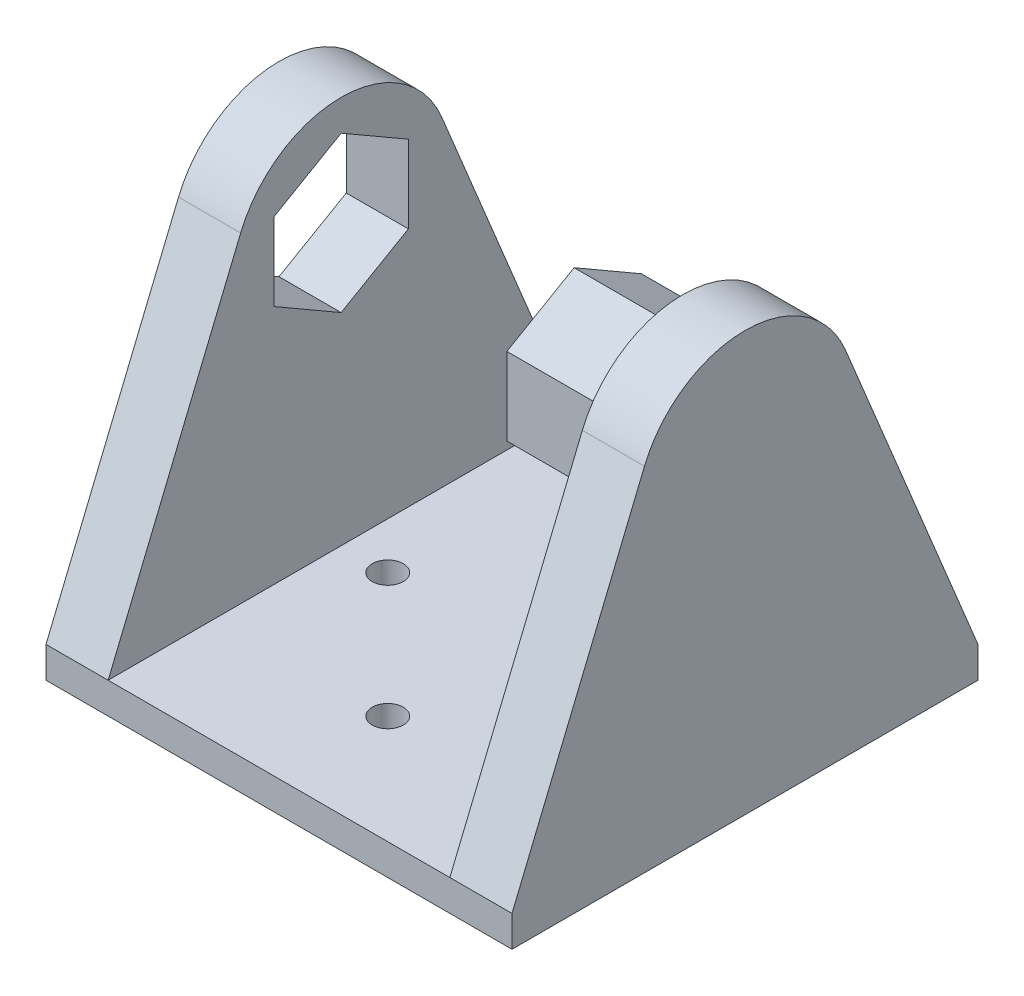
ISO-10303-21;
HEADER;
FILE_DESCRIPTION(('STEP AP214'),'2;1');
FILE_NAME('part.step','',(''),(''),'','','');
FILE_SCHEMA(('AUTOMOTIVE_DESIGN { 1 0 10303 214 1 1 1 1 }'));
ENDSEC;
DATA;
#1=APPLICATION_CONTEXT('core data for automotive mechanical design processes');
#2=APPLICATION_PROTOCOL_DEFINITION('international standard','automotive_design',2000,#1);
#3=PRODUCT_CONTEXT('',#1,'mechanical');
#4=PRODUCT('Part','Part','',(#3));
#5=PRODUCT_RELATED_PRODUCT_CATEGORY('part','',(#4));
#6=PRODUCT_DEFINITION_FORMATION('','',#4);
#7=PRODUCT_DEFINITION_CONTEXT('part definition',#1,'design');
#8=PRODUCT_DEFINITION('design','',#6,#7);
#9=PRODUCT_DEFINITION_SHAPE('','',#8);
#10=(LENGTH_UNIT() NAMED_UNIT(*) SI_UNIT(.MILLI.,.METRE.));
#11=(NAMED_UNIT(*) PLANE_ANGLE_UNIT() SI_UNIT($,.RADIAN.));
#12=(NAMED_UNIT(*) SI_UNIT($,.STERADIAN.) SOLID_ANGLE_UNIT());
#13=UNCERTAINTY_MEASURE_WITH_UNIT(LENGTH_MEASURE(1.E-05),#10,'distance_accuracy_value','');
#14=(GEOMETRIC_REPRESENTATION_CONTEXT(3) GLOBAL_UNCERTAINTY_ASSIGNED_CONTEXT((#13)) GLOBAL_UNIT_ASSIGNED_CONTEXT((#10,
#11,#12)) REPRESENTATION_CONTEXT('',''));
#15=CARTESIAN_POINT('',(0.,0.,0.));
#16=DIRECTION('',(0.,0.,1.));
#17=DIRECTION('',(1.,0.,0.));
#18=AXIS2_PLACEMENT_3D('',#15,#16,#17);
#19=CARTESIAN_POINT('',(11.,27.,-15.));
#20=DIRECTION('',(1.,0.,0.));
#21=DIRECTION('',(0.,0.,-1.));
#22=AXIS2_PLACEMENT_3D('',#19,#20,#21);
#23=PLANE('',#22);
#24=CARTESIAN_POINT('',(11.,20.,0.));
#25=DIRECTION('',(1.,0.,0.));
#26=DIRECTION('',(0.,0.,-1.));
#27=AXIS2_PLACEMENT_3D('',#24,#25,#26);
#28=CIRCLE('',#27,7.);
#29=CARTESIAN_POINT('',(11.,22.6700753668029,-6.47075710683012));
#30=VERTEX_POINT('',#29);
#31=CARTESIAN_POINT('',(11.,22.6700753668029,6.47075710683011));
#32=VERTEX_POINT('',#31);
#33=EDGE_CURVE('E346',#30,#32,#28,.T.);
#34=ORIENTED_EDGE('',*,*,#33,.F.);
#35=DIRECTION('',(0.,-0.924393872404303,-0.381439338114697));
#36=VECTOR('',#35,1.);
#37=CARTESIAN_POINT('',(11.,23.3626007834656,-6.18499532882054));
#38=LINE('',#37,#36);
#39=CARTESIAN_POINT('',(11.,2.,-15.));
#40=VERTEX_POINT('',#39);
#41=EDGE_CURVE('E318',#30,#40,#38,.T.);
#42=ORIENTED_EDGE('',*,*,#41,.T.);
#43=DIRECTION('',(0.,0.,1.));
#44=VECTOR('',#43,1.);
#45=CARTESIAN_POINT('',(11.,2.,-15.));
#46=LINE('',#45,#44);
#47=CARTESIAN_POINT('',(11.,2.,15.));
#48=VERTEX_POINT('',#47);
#49=EDGE_CURVE('E361',#40,#48,#46,.T.);
#50=ORIENTED_EDGE('',*,*,#49,.T.);
#51=DIRECTION('',(0.,-0.924393872404303,0.381439338114697));
#52=VECTOR('',#51,1.);
#53=CARTESIAN_POINT('',(11.,33.9406063888809,1.82011626897919));
#54=LINE('',#53,#52);
#55=EDGE_CURVE('E437',#32,#48,#54,.T.);
#56=ORIENTED_EDGE('',*,*,#55,.F.);
#57=EDGE_LOOP('',(#34,#42,#50,#56));
#58=FACE_BOUND('',#57,.T.);
#59=DIRECTION('',(0.,0.5,-0.866025403784438));
#60=VECTOR('',#59,1.);
#61=CARTESIAN_POINT('',(11.,22.5,4.3301270189222));
#62=LINE('',#61,#60);
#63=CARTESIAN_POINT('',(11.,22.5,4.3301270189222));
#64=VERTEX_POINT('',#63);
#65=CARTESIAN_POINT('',(11.,25.,0.));
#66=VERTEX_POINT('',#65);
#67=EDGE_CURVE('E228',#64,#66,#62,.T.);
#68=ORIENTED_EDGE('',*,*,#67,.F.);
#69=DIRECTION('',(0.,1.,0.));
#70=VECTOR('',#69,1.);
#71=CARTESIAN_POINT('',(11.,17.5,4.3301270189222));
#72=LINE('',#71,#70);
#73=CARTESIAN_POINT('',(11.,17.5,4.3301270189222));
#74=VERTEX_POINT('',#73);
#75=EDGE_CURVE('E244',#74,#64,#72,.T.);
#76=ORIENTED_EDGE('',*,*,#75,.F.);
#77=DIRECTION('',(0.,0.5,0.866025403784439));
#78=VECTOR('',#77,1.);
#79=CARTESIAN_POINT('',(11.,15.,0.));
#80=LINE('',#79,#78);
#81=CARTESIAN_POINT('',(11.,15.,0.));
#82=VERTEX_POINT('',#81);
#83=EDGE_CURVE('E275',#82,#74,#80,.T.);
#84=ORIENTED_EDGE('',*,*,#83,.F.);
#85=DIRECTION('',(0.,-0.5,0.866025403784439));
#86=VECTOR('',#85,1.);
#87=CARTESIAN_POINT('',(11.,17.5,-4.33012701892219));
#88=LINE('',#87,#86);
#89=CARTESIAN_POINT('',(11.,17.5,-4.3301270189222));
#90=VERTEX_POINT('',#89);
#91=EDGE_CURVE('E271',#90,#82,#88,.T.);
#92=ORIENTED_EDGE('',*,*,#91,.F.);
#93=DIRECTION('',(0.,-1.,0.));
#94=VECTOR('',#93,1.);
#95=CARTESIAN_POINT('',(11.,22.5,-4.33012701892219));
#96=LINE('',#95,#94);
#97=CARTESIAN_POINT('',(11.,22.5,-4.33012701892219));
#98=VERTEX_POINT('',#97);
#99=EDGE_CURVE('E267',#98,#90,#96,.T.);
#100=ORIENTED_EDGE('',*,*,#99,.F.);
#101=DIRECTION('',(0.,-0.5,-0.866025403784438));
#102=VECTOR('',#101,1.);
#103=CARTESIAN_POINT('',(11.,25.,0.));
#104=LINE('',#103,#102);
#105=EDGE_CURVE('E263',#66,#98,#104,.T.);
#106=ORIENTED_EDGE('',*,*,#105,.F.);
#107=EDGE_LOOP('',(#68,#76,#84,#92,#100,#106));
#108=FACE_BOUND('',#107,.T.);
#109=ADVANCED_FACE('F38',(#58,#108),#23,.F.);
#110=CARTESIAN_POINT('',(15.,2.,15.));
#111=DIRECTION('',(-1.,0.,0.));
#112=DIRECTION('',(0.,0.,1.));
#113=AXIS2_PLACEMENT_3D('',#110,#111,#112);
#114=PLANE('',#113);
#115=DIRECTION('',(0.,0.924393872404303,0.381439338114697));
#116=VECTOR('',#115,1.);
#117=CARTESIAN_POINT('',(15.,12.5780056054154,-10.6351209401587));
#118=LINE('',#117,#116);
#119=CARTESIAN_POINT('',(15.,2.,-15.));
#120=VERTEX_POINT('',#119);
#121=CARTESIAN_POINT('',(15.,22.6700753668029,-6.47075710683012));
#122=VERTEX_POINT('',#121);
#123=EDGE_CURVE('E326',#120,#122,#118,.T.);
#124=ORIENTED_EDGE('',*,*,#123,.T.);
#125=CARTESIAN_POINT('',(15.,20.,0.));
#126=DIRECTION('',(-1.,0.,0.));
#127=DIRECTION('',(0.,0.,1.));
#128=AXIS2_PLACEMENT_3D('',#125,#126,#127);
#129=CIRCLE('',#128,7.);
#130=CARTESIAN_POINT('',(15.,22.6700753668029,6.47075710683011));
#131=VERTEX_POINT('',#130);
#132=EDGE_CURVE('E352',#131,#122,#129,.T.);
#133=ORIENTED_EDGE('',*,*,#132,.F.);
#134=DIRECTION('',(0.,0.924393872404303,-0.381439338114697));
#135=VECTOR('',#134,1.);
#136=CARTESIAN_POINT('',(15.,2.,15.));
#137=LINE('',#136,#135);
#138=CARTESIAN_POINT('',(15.,2.,15.));
#139=VERTEX_POINT('',#138);
#140=EDGE_CURVE('E358',#139,#131,#137,.T.);
#141=ORIENTED_EDGE('',*,*,#140,.F.);
#142=DIRECTION('',(0.,-1.,0.));
#143=VECTOR('',#142,1.);
#144=CARTESIAN_POINT('',(15.,2.,15.));
#145=LINE('',#144,#143);
#146=CARTESIAN_POINT('',(15.,0.,15.));
#147=VERTEX_POINT('',#146);
#148=EDGE_CURVE('E411',#139,#147,#145,.T.);
#149=ORIENTED_EDGE('',*,*,#148,.T.);
#150=DIRECTION('',(0.,0.,-1.));
#151=VECTOR('',#150,1.);
#152=CARTESIAN_POINT('',(15.,0.,15.));
#153=LINE('',#152,#151);
#154=CARTESIAN_POINT('',(15.,0.,-15.));
#155=VERTEX_POINT('',#154);
#156=EDGE_CURVE('E374',#147,#155,#153,.T.);
#157=ORIENTED_EDGE('',*,*,#156,.T.);
#158=DIRECTION('',(0.,-1.,0.));
#159=VECTOR('',#158,1.);
#160=CARTESIAN_POINT('',(15.,2.,-15.));
#161=LINE('',#160,#159);
#162=EDGE_CURVE('E434',#120,#155,#161,.T.);
#163=ORIENTED_EDGE('',*,*,#162,.F.);
#164=EDGE_LOOP('',(#124,#133,#141,#149,#157,#163));
#165=FACE_BOUND('',#164,.T.);
#166=ADVANCED_FACE('F40',(#165),#114,.F.);
#167=CARTESIAN_POINT('',(-15.,2.,15.));
#168=DIRECTION('',(1.,0.,0.));
#169=DIRECTION('',(0.,0.,-1.));
#170=AXIS2_PLACEMENT_3D('',#167,#168,#169);
#171=PLANE('',#170);
#172=DIRECTION('',(0.,-0.5,-0.866025403784439));
#173=VECTOR('',#172,1.);
#174=CARTESIAN_POINT('',(-15.,25.,0.));
#175=LINE('',#174,#173);
#176=CARTESIAN_POINT('',(-15.,25.,0.));
#177=VERTEX_POINT('',#176);
#178=CARTESIAN_POINT('',(-15.,22.5,-4.33012701892219));
#179=VERTEX_POINT('',#178);
#180=EDGE_CURVE('E201',#177,#179,#175,.T.);
#181=ORIENTED_EDGE('',*,*,#180,.F.);
#182=DIRECTION('',(0.,0.5,-0.866025403784439));
#183=VECTOR('',#182,1.);
#184=CARTESIAN_POINT('',(-15.,22.5,4.3301270189222));
#185=LINE('',#184,#183);
#186=CARTESIAN_POINT('',(-15.,22.5,4.3301270189222));
#187=VERTEX_POINT('',#186);
#188=EDGE_CURVE('E54',#187,#177,#185,.T.);
#189=ORIENTED_EDGE('',*,*,#188,.F.);
#190=DIRECTION('',(0.,1.,0.));
#191=VECTOR('',#190,1.);
#192=CARTESIAN_POINT('',(-15.,17.5,4.3301270189222));
#193=LINE('',#192,#191);
#194=CARTESIAN_POINT('',(-15.,17.5,4.3301270189222));
#195=VERTEX_POINT('',#194);
#196=EDGE_CURVE('E221',#195,#187,#193,.T.);
#197=ORIENTED_EDGE('',*,*,#196,.F.);
#198=DIRECTION('',(0.,0.5,0.866025403784438));
#199=VECTOR('',#198,1.);
#200=CARTESIAN_POINT('',(-15.,15.,0.));
#201=LINE('',#200,#199);
#202=CARTESIAN_POINT('',(-15.,15.,0.));
#203=VERTEX_POINT('',#202);
#204=EDGE_CURVE('E214',#203,#195,#201,.T.);
#205=ORIENTED_EDGE('',*,*,#204,.F.);
#206=DIRECTION('',(0.,-0.5,0.866025403784438));
#207=VECTOR('',#206,1.);
#208=CARTESIAN_POINT('',(-15.,17.5,-4.33012701892219));
#209=LINE('',#208,#207);
#210=CARTESIAN_POINT('',(-15.,17.5,-4.33012701892219));
#211=VERTEX_POINT('',#210);
#212=EDGE_CURVE('E210',#211,#203,#209,.T.);
#213=ORIENTED_EDGE('',*,*,#212,.F.);
#214=DIRECTION('',(0.,-1.,0.));
#215=VECTOR('',#214,1.);
#216=CARTESIAN_POINT('',(-15.,22.5,-4.33012701892219));
#217=LINE('',#216,#215);
#218=EDGE_CURVE('E191',#179,#211,#217,.T.);
#219=ORIENTED_EDGE('',*,*,#218,.F.);
#220=EDGE_LOOP('',(#181,#189,#197,#205,#213,#219));
#221=FACE_BOUND('',#220,.T.);
#222=CARTESIAN_POINT('',(-15.,20.,0.));
#223=DIRECTION('',(-1.,0.,0.));
#224=DIRECTION('',(0.,0.,1.));
#225=AXIS2_PLACEMENT_3D('',#222,#223,#224);
#226=CIRCLE('',#225,7.);
#227=CARTESIAN_POINT('',(-15.,22.6700753668029,6.47075710683011));
#228=VERTEX_POINT('',#227);
#229=CARTESIAN_POINT('',(-15.,22.6700753668029,-6.47075710683012));
#230=VERTEX_POINT('',#229);
#231=EDGE_CURVE('E330',#228,#230,#226,.T.);
#232=ORIENTED_EDGE('',*,*,#231,.T.);
#233=DIRECTION('',(0.,0.924393872404303,0.381439338114697));
#234=VECTOR('',#233,1.);
#235=CARTESIAN_POINT('',(-15.,5.57999474003043,-13.5227608437737));
#236=LINE('',#235,#234);
#237=CARTESIAN_POINT('',(-15.,2.,-15.));
#238=VERTEX_POINT('',#237);
#239=EDGE_CURVE('E305',#238,#230,#236,.T.);
#240=ORIENTED_EDGE('',*,*,#239,.F.);
#241=DIRECTION('',(0.,-1.,0.));
#242=VECTOR('',#241,1.);
#243=CARTESIAN_POINT('',(-15.,2.,-15.));
#244=LINE('',#243,#242);
#245=CARTESIAN_POINT('',(-15.,0.,-15.));
#246=VERTEX_POINT('',#245);
#247=EDGE_CURVE('E431',#238,#246,#244,.T.);
#248=ORIENTED_EDGE('',*,*,#247,.T.);
#249=DIRECTION('',(0.,0.,1.));
#250=VECTOR('',#249,1.);
#251=CARTESIAN_POINT('',(-15.,0.,15.));
#252=LINE('',#251,#250);
#253=CARTESIAN_POINT('',(-15.,0.,15.));
#254=VERTEX_POINT('',#253);
#255=EDGE_CURVE('E419',#246,#254,#252,.T.);
#256=ORIENTED_EDGE('',*,*,#255,.T.);
#257=DIRECTION('',(0.,-1.,0.));
#258=VECTOR('',#257,1.);
#259=CARTESIAN_POINT('',(-15.,2.,15.));
#260=LINE('',#259,#258);
#261=CARTESIAN_POINT('',(-15.,2.,15.));
#262=VERTEX_POINT('',#261);
#263=EDGE_CURVE('E428',#262,#254,#260,.T.);
#264=ORIENTED_EDGE('',*,*,#263,.F.);
#265=DIRECTION('',(0.,0.924393872404303,-0.381439338114697));
#266=VECTOR('',#265,1.);
#267=CARTESIAN_POINT('',(-15.,5.57999474003043,13.5227608437737));
#268=LINE('',#267,#266);
#269=EDGE_CURVE('E333',#262,#228,#268,.T.);
#270=ORIENTED_EDGE('',*,*,#269,.T.);
#271=EDGE_LOOP('',(#232,#240,#248,#256,#264,#270));
#272=FACE_BOUND('',#271,.T.);
#273=ADVANCED_FACE('F206',(#221,#272),#171,.F.);
#274=CARTESIAN_POINT('',(-11.,27.,-15.));
#275=DIRECTION('',(-1.,0.,0.));
#276=DIRECTION('',(0.,0.,1.));
#277=AXIS2_PLACEMENT_3D('',#274,#275,#276);
#278=PLANE('',#277);
#279=DIRECTION('',(0.,1.,0.));
#280=VECTOR('',#279,1.);
#281=CARTESIAN_POINT('',(-11.,27.,4.3301270189222));
#282=LINE('',#281,#280);
#283=CARTESIAN_POINT('',(-11.,17.5,4.3301270189222));
#284=VERTEX_POINT('',#283);
#285=CARTESIAN_POINT('',(-11.,22.5,4.3301270189222));
#286=VERTEX_POINT('',#285);
#287=EDGE_CURVE('E47',#284,#286,#282,.T.);
#288=ORIENTED_EDGE('',*,*,#287,.T.);
#289=DIRECTION('',(0.,0.5,-0.866025403784439));
#290=VECTOR('',#289,1.);
#291=CARTESIAN_POINT('',(-11.,31.9951905283833,-12.1160254037844));
#292=LINE('',#291,#290);
#293=CARTESIAN_POINT('',(-11.,25.,0.));
#294=VERTEX_POINT('',#293);
#295=EDGE_CURVE('E11',#286,#294,#292,.T.);
#296=ORIENTED_EDGE('',*,*,#295,.T.);
#297=DIRECTION('',(0.,-0.5,-0.866025403784439));
#298=VECTOR('',#297,1.);
#299=CARTESIAN_POINT('',(-11.,19.0048094716167,-10.3839745962156));
#300=LINE('',#299,#298);
#301=CARTESIAN_POINT('',(-11.,22.5,-4.33012701892219));
#302=VERTEX_POINT('',#301);
#303=EDGE_CURVE('E440',#294,#302,#300,.T.);
#304=ORIENTED_EDGE('',*,*,#303,.T.);
#305=DIRECTION('',(0.,-1.,0.));
#306=VECTOR('',#305,1.);
#307=CARTESIAN_POINT('',(-11.,27.,-4.33012701892219));
#308=LINE('',#307,#306);
#309=CARTESIAN_POINT('',(-11.,17.5,-4.33012701892219));
#310=VERTEX_POINT('',#309);
#311=EDGE_CURVE('E194',#302,#310,#308,.T.);
#312=ORIENTED_EDGE('',*,*,#311,.T.);
#313=DIRECTION('',(0.,-0.5,0.866025403784438));
#314=VECTOR('',#313,1.);
#315=CARTESIAN_POINT('',(-11.,24.4951905283833,-16.4461524227066));
#316=LINE('',#315,#314);
#317=CARTESIAN_POINT('',(-11.,15.,0.));
#318=VERTEX_POINT('',#317);
#319=EDGE_CURVE('E445',#310,#318,#316,.T.);
#320=ORIENTED_EDGE('',*,*,#319,.T.);
#321=DIRECTION('',(0.,0.5,0.866025403784439));
#322=VECTOR('',#321,1.);
#323=CARTESIAN_POINT('',(-11.,11.5048094716167,-6.05384757729337));
#324=LINE('',#323,#322);
#325=EDGE_CURVE('E449',#318,#284,#324,.T.);
#326=ORIENTED_EDGE('',*,*,#325,.T.);
#327=EDGE_LOOP('',(#288,#296,#304,#312,#320,#326));
#328=FACE_BOUND('',#327,.T.);
#329=DIRECTION('',(0.,0.924393872404303,0.381439338114697));
#330=VECTOR('',#329,1.);
#331=CARTESIAN_POINT('',(-11.,23.3626007834656,-6.18499532882054));
#332=LINE('',#331,#330);
#333=CARTESIAN_POINT('',(-11.,2.,-15.));
#334=VERTEX_POINT('',#333);
#335=CARTESIAN_POINT('',(-11.,22.6700753668029,-6.47075710683012));
#336=VERTEX_POINT('',#335);
#337=EDGE_CURVE('E322',#334,#336,#332,.T.);
#338=ORIENTED_EDGE('',*,*,#337,.T.);
#339=CARTESIAN_POINT('',(-11.,20.,0.));
#340=DIRECTION('',(-1.,0.,0.));
#341=DIRECTION('',(0.,0.,1.));
#342=AXIS2_PLACEMENT_3D('',#339,#340,#341);
#343=CIRCLE('',#342,7.);
#344=CARTESIAN_POINT('',(-11.,22.6700753668029,6.47075710683011));
#345=VERTEX_POINT('',#344);
#346=EDGE_CURVE('E349',#345,#336,#343,.T.);
#347=ORIENTED_EDGE('',*,*,#346,.F.);
#348=DIRECTION('',(0.,0.924393872404303,-0.381439338114697));
#349=VECTOR('',#348,1.);
#350=CARTESIAN_POINT('',(-11.,33.9406063888809,1.82011626897919));
#351=LINE('',#350,#349);
#352=CARTESIAN_POINT('',(-11.,2.,15.));
#353=VERTEX_POINT('',#352);
#354=EDGE_CURVE('E355',#353,#345,#351,.T.);
#355=ORIENTED_EDGE('',*,*,#354,.F.);
#356=DIRECTION('',(0.,0.,-1.));
#357=VECTOR('',#356,1.);
#358=CARTESIAN_POINT('',(-11.,2.,-15.));
#359=LINE('',#358,#357);
#360=EDGE_CURVE('E365',#353,#334,#359,.T.);
#361=ORIENTED_EDGE('',*,*,#360,.T.);
#362=EDGE_LOOP('',(#338,#347,#355,#361));
#363=FACE_BOUND('',#362,.T.);
#364=ADVANCED_FACE('F455',(#328,#363),#278,.F.);
#365=CARTESIAN_POINT('',(-15.,2.,15.));
#366=DIRECTION('',(0.,0.,-1.));
#367=DIRECTION('',(-1.,0.,0.));
#368=AXIS2_PLACEMENT_3D('',#365,#366,#367);
#369=PLANE('',#368);
#370=DIRECTION('',(-1.,0.,0.));
#371=VECTOR('',#370,1.);
#372=CARTESIAN_POINT('',(23.,2.,15.));
#373=LINE('',#372,#371);
#374=EDGE_CURVE('E338',#353,#262,#373,.T.);
#375=ORIENTED_EDGE('',*,*,#374,.T.);
#376=ORIENTED_EDGE('',*,*,#263,.T.);
#377=DIRECTION('',(1.,0.,0.));
#378=VECTOR('',#377,1.);
#379=CARTESIAN_POINT('',(-15.,0.,15.));
#380=LINE('',#379,#378);
#381=EDGE_CURVE('E407',#254,#147,#380,.T.);
#382=ORIENTED_EDGE('',*,*,#381,.T.);
#383=ORIENTED_EDGE('',*,*,#148,.F.);
#384=EDGE_CURVE('E342',#139,#48,#373,.T.);
#385=ORIENTED_EDGE('',*,*,#384,.T.);
#386=DIRECTION('',(1.,0.,0.));
#387=VECTOR('',#386,1.);
#388=CARTESIAN_POINT('',(-15.,2.,15.));
#389=LINE('',#388,#387);
#390=EDGE_CURVE('E406',#353,#48,#389,.T.);
#391=ORIENTED_EDGE('',*,*,#390,.F.);
#392=EDGE_LOOP('',(#375,#376,#382,#383,#385,#391));
#393=FACE_BOUND('',#392,.T.);
#394=ADVANCED_FACE('F495',(#393),#369,.F.);
#395=CARTESIAN_POINT('',(0.,2.,0.));
#396=DIRECTION('',(0.,-1.,0.));
#397=DIRECTION('',(0.,0.,-1.));
#398=AXIS2_PLACEMENT_3D('',#395,#396,#397);
#399=PLANE('',#398);
#400=CARTESIAN_POINT('',(0.,2.,-8.));
#401=DIRECTION('',(0.,1.,0.));
#402=DIRECTION('',(0.,0.,1.));
#403=AXIS2_PLACEMENT_3D('',#400,#401,#402);
#404=CIRCLE('',#403,1.);
#405=CARTESIAN_POINT('',(0.,2.,-7.));
#406=VERTEX_POINT('',#405);
#407=EDGE_CURVE('E375',#406,#406,#404,.T.);
#408=ORIENTED_EDGE('',*,*,#407,.F.);
#409=EDGE_LOOP('',(#408));
#410=FACE_BOUND('',#409,.T.);
#411=CARTESIAN_POINT('',(8.,2.,0.));
#412=DIRECTION('',(0.,1.,0.));
#413=DIRECTION('',(0.,0.,1.));
#414=AXIS2_PLACEMENT_3D('',#411,#412,#413);
#415=CIRCLE('',#414,1.);
#416=CARTESIAN_POINT('',(8.,2.,0.999999999999999));
#417=VERTEX_POINT('',#416);
#418=EDGE_CURVE('E383',#417,#417,#415,.T.);
#419=ORIENTED_EDGE('',*,*,#418,.F.);
#420=EDGE_LOOP('',(#419));
#421=FACE_BOUND('',#420,.T.);
#422=CARTESIAN_POINT('',(-8.,2.,0.));
#423=DIRECTION('',(0.,1.,0.));
#424=DIRECTION('',(0.,0.,1.));
#425=AXIS2_PLACEMENT_3D('',#422,#423,#424);
#426=CIRCLE('',#425,1.);
#427=CARTESIAN_POINT('',(-8.,2.,1.));
#428=VERTEX_POINT('',#427);
#429=EDGE_CURVE('E391',#428,#428,#426,.T.);
#430=ORIENTED_EDGE('',*,*,#429,.F.);
#431=EDGE_LOOP('',(#430));
#432=FACE_BOUND('',#431,.T.);
#433=CARTESIAN_POINT('',(0.,2.,8.));
#434=DIRECTION('',(0.,1.,0.));
#435=DIRECTION('',(0.,0.,1.));
#436=AXIS2_PLACEMENT_3D('',#433,#434,#435);
#437=CIRCLE('',#436,1.);
#438=CARTESIAN_POINT('',(0.,2.,9.));
#439=VERTEX_POINT('',#438);
#440=EDGE_CURVE('E369',#439,#439,#437,.T.);
#441=ORIENTED_EDGE('',*,*,#440,.F.);
#442=EDGE_LOOP('',(#441));
#443=FACE_BOUND('',#442,.T.);
#444=ORIENTED_EDGE('',*,*,#49,.F.);
#445=DIRECTION('',(-1.,0.,0.));
#446=VECTOR('',#445,1.);
#447=CARTESIAN_POINT('',(-15.,2.,-15.));
#448=LINE('',#447,#446);
#449=EDGE_CURVE('E402',#40,#334,#448,.T.);
#450=ORIENTED_EDGE('',*,*,#449,.T.);
#451=ORIENTED_EDGE('',*,*,#360,.F.);
#452=ORIENTED_EDGE('',*,*,#390,.T.);
#453=EDGE_LOOP('',(#444,#450,#451,#452));
#454=FACE_BOUND('',#453,.T.);
#455=ADVANCED_FACE('F513',(#410,#421,#432,#443,#454),#399,.F.);
#456=CARTESIAN_POINT('',(-15.,2.,-15.));
#457=DIRECTION('',(0.,0.,1.));
#458=DIRECTION('',(1.,0.,0.));
#459=AXIS2_PLACEMENT_3D('',#456,#457,#458);
#460=PLANE('',#459);
#461=ORIENTED_EDGE('',*,*,#247,.F.);
#462=DIRECTION('',(-1.,0.,0.));
#463=VECTOR('',#462,1.);
#464=CARTESIAN_POINT('',(23.,2.,-15.));
#465=LINE('',#464,#463);
#466=EDGE_CURVE('E309',#334,#238,#465,.T.);
#467=ORIENTED_EDGE('',*,*,#466,.F.);
#468=ORIENTED_EDGE('',*,*,#449,.F.);
#469=EDGE_CURVE('E315',#120,#40,#465,.T.);
#470=ORIENTED_EDGE('',*,*,#469,.F.);
#471=ORIENTED_EDGE('',*,*,#162,.T.);
#472=DIRECTION('',(-1.,0.,0.));
#473=VECTOR('',#472,1.);
#474=CARTESIAN_POINT('',(-15.,0.,-15.));
#475=LINE('',#474,#473);
#476=EDGE_CURVE('E415',#155,#246,#475,.T.);
#477=ORIENTED_EDGE('',*,*,#476,.T.);
#478=EDGE_LOOP('',(#461,#467,#468,#470,#471,#477));
#479=FACE_BOUND('',#478,.T.);
#480=ADVANCED_FACE('F516',(#479),#460,.F.);
#481=CARTESIAN_POINT('',(0.,0.,0.));
#482=DIRECTION('',(0.,-1.,0.));
#483=DIRECTION('',(0.,0.,-1.));
#484=AXIS2_PLACEMENT_3D('',#481,#482,#483);
#485=PLANE('',#484);
#486=CARTESIAN_POINT('',(0.,0.,-8.));
#487=DIRECTION('',(0.,1.,0.));
#488=DIRECTION('',(0.,0.,1.));
#489=AXIS2_PLACEMENT_3D('',#486,#487,#488);
#490=CIRCLE('',#489,1.);
#491=CARTESIAN_POINT('',(0.,0.,-7.));
#492=VERTEX_POINT('',#491);
#493=EDGE_CURVE('E370',#492,#492,#490,.T.);
#494=ORIENTED_EDGE('',*,*,#493,.T.);
#495=EDGE_LOOP('',(#494));
#496=FACE_BOUND('',#495,.T.);
#497=CARTESIAN_POINT('',(8.,0.,0.));
#498=DIRECTION('',(0.,1.,0.));
#499=DIRECTION('',(0.,0.,1.));
#500=AXIS2_PLACEMENT_3D('',#497,#498,#499);
#501=CIRCLE('',#500,1.);
#502=CARTESIAN_POINT('',(8.,0.,0.999999999999999));
#503=VERTEX_POINT('',#502);
#504=EDGE_CURVE('E379',#503,#503,#501,.T.);
#505=ORIENTED_EDGE('',*,*,#504,.T.);
#506=EDGE_LOOP('',(#505));
#507=FACE_BOUND('',#506,.T.);
#508=CARTESIAN_POINT('',(-8.,0.,0.));
#509=DIRECTION('',(0.,1.,0.));
#510=DIRECTION('',(0.,0.,1.));
#511=AXIS2_PLACEMENT_3D('',#508,#509,#510);
#512=CIRCLE('',#511,1.);
#513=CARTESIAN_POINT('',(-8.,0.,1.));
#514=VERTEX_POINT('',#513);
#515=EDGE_CURVE('E387',#514,#514,#512,.T.);
#516=ORIENTED_EDGE('',*,*,#515,.T.);
#517=EDGE_LOOP('',(#516));
#518=FACE_BOUND('',#517,.T.);
#519=CARTESIAN_POINT('',(0.,0.,8.));
#520=DIRECTION('',(0.,1.,0.));
#521=DIRECTION('',(0.,0.,1.));
#522=AXIS2_PLACEMENT_3D('',#519,#520,#521);
#523=CIRCLE('',#522,1.);
#524=CARTESIAN_POINT('',(0.,0.,9.));
#525=VERTEX_POINT('',#524);
#526=EDGE_CURVE('E395',#525,#525,#523,.T.);
#527=ORIENTED_EDGE('',*,*,#526,.T.);
#528=EDGE_LOOP('',(#527));
#529=FACE_BOUND('',#528,.T.);
#530=ORIENTED_EDGE('',*,*,#156,.F.);
#531=ORIENTED_EDGE('',*,*,#381,.F.);
#532=ORIENTED_EDGE('',*,*,#255,.F.);
#533=ORIENTED_EDGE('',*,*,#476,.F.);
#534=EDGE_LOOP('',(#530,#531,#532,#533));
#535=FACE_BOUND('',#534,.T.);
#536=ADVANCED_FACE('F511',(#496,#507,#518,#529,#535),#485,.T.);
#537=CARTESIAN_POINT('',(0.,0.,8.));
#538=DIRECTION('',(0.,1.,0.));
#539=DIRECTION('',(0.,0.,1.));
#540=AXIS2_PLACEMENT_3D('',#537,#538,#539);
#541=CYLINDRICAL_SURFACE('',#540,1.);
#542=ORIENTED_EDGE('',*,*,#526,.F.);
#543=EDGE_LOOP('',(#542));
#544=FACE_BOUND('',#543,.T.);
#545=ORIENTED_EDGE('',*,*,#440,.T.);
#546=EDGE_LOOP('',(#545));
#547=FACE_BOUND('',#546,.T.);
#548=ADVANCED_FACE('F507',(#544,#547),#541,.F.);
#549=CARTESIAN_POINT('',(-8.,0.,0.));
#550=DIRECTION('',(0.,1.,0.));
#551=DIRECTION('',(0.,0.,1.));
#552=AXIS2_PLACEMENT_3D('',#549,#550,#551);
#553=CYLINDRICAL_SURFACE('',#552,1.);
#554=ORIENTED_EDGE('',*,*,#515,.F.);
#555=EDGE_LOOP('',(#554));
#556=FACE_BOUND('',#555,.T.);
#557=ORIENTED_EDGE('',*,*,#429,.T.);
#558=EDGE_LOOP('',(#557));
#559=FACE_BOUND('',#558,.T.);
#560=ADVANCED_FACE('F503',(#556,#559),#553,.F.);
#561=CARTESIAN_POINT('',(8.,0.,0.));
#562=DIRECTION('',(0.,1.,0.));
#563=DIRECTION('',(0.,0.,1.));
#564=AXIS2_PLACEMENT_3D('',#561,#562,#563);
#565=CYLINDRICAL_SURFACE('',#564,1.);
#566=ORIENTED_EDGE('',*,*,#504,.F.);
#567=EDGE_LOOP('',(#566));
#568=FACE_BOUND('',#567,.T.);
#569=ORIENTED_EDGE('',*,*,#418,.T.);
#570=EDGE_LOOP('',(#569));
#571=FACE_BOUND('',#570,.T.);
#572=ADVANCED_FACE('F499',(#568,#571),#565,.F.);
#573=CARTESIAN_POINT('',(0.,0.,-8.));
#574=DIRECTION('',(0.,1.,0.));
#575=DIRECTION('',(0.,0.,1.));
#576=AXIS2_PLACEMENT_3D('',#573,#574,#575);
#577=CYLINDRICAL_SURFACE('',#576,1.);
#578=ORIENTED_EDGE('',*,*,#493,.F.);
#579=EDGE_LOOP('',(#578));
#580=FACE_BOUND('',#579,.T.);
#581=ORIENTED_EDGE('',*,*,#407,.T.);
#582=EDGE_LOOP('',(#581));
#583=FACE_BOUND('',#582,.T.);
#584=ADVANCED_FACE('F496',(#580,#583),#577,.F.);
#585=CARTESIAN_POINT('',(23.,20.,0.));
#586=DIRECTION('',(-1.,0.,0.));
#587=DIRECTION('',(0.,0.,1.));
#588=AXIS2_PLACEMENT_3D('',#585,#586,#587);
#589=CYLINDRICAL_SURFACE('',#588,7.);
#590=ORIENTED_EDGE('',*,*,#132,.T.);
#591=DIRECTION('',(-1.,0.,0.));
#592=VECTOR('',#591,1.);
#593=CARTESIAN_POINT('',(23.,22.6700753668029,-6.47075710683012));
#594=LINE('',#593,#592);
#595=EDGE_CURVE('E314',#122,#30,#594,.T.);
#596=ORIENTED_EDGE('',*,*,#595,.T.);
#597=ORIENTED_EDGE('',*,*,#33,.T.);
#598=DIRECTION('',(-1.,0.,0.));
#599=VECTOR('',#598,1.);
#600=CARTESIAN_POINT('',(23.,22.6700753668029,6.47075710683011));
#601=LINE('',#600,#599);
#602=EDGE_CURVE('E343',#131,#32,#601,.T.);
#603=ORIENTED_EDGE('',*,*,#602,.F.);
#604=EDGE_LOOP('',(#590,#596,#597,#603));
#605=FACE_BOUND('',#604,.T.);
#606=ADVANCED_FACE('F491',(#605),#589,.T.);
#607=CARTESIAN_POINT('',(23.,5.57999474003043,13.5227608437737));
#608=DIRECTION('',(0.,0.381439338114697,0.924393872404303));
#609=DIRECTION('',(0.,-0.924393872404303,0.381439338114697));
#610=AXIS2_PLACEMENT_3D('',#607,#608,#609);
#611=PLANE('',#610);
#612=ORIENTED_EDGE('',*,*,#140,.T.);
#613=ORIENTED_EDGE('',*,*,#602,.T.);
#614=ORIENTED_EDGE('',*,*,#55,.T.);
#615=ORIENTED_EDGE('',*,*,#384,.F.);
#616=EDGE_LOOP('',(#612,#613,#614,#615));
#617=FACE_BOUND('',#616,.T.);
#618=ADVANCED_FACE('F567',(#617),#611,.T.);
#619=ORIENTED_EDGE('',*,*,#354,.T.);
#620=EDGE_CURVE('E337',#345,#228,#601,.T.);
#621=ORIENTED_EDGE('',*,*,#620,.T.);
#622=ORIENTED_EDGE('',*,*,#269,.F.);
#623=ORIENTED_EDGE('',*,*,#374,.F.);
#624=EDGE_LOOP('',(#619,#621,#622,#623));
#625=FACE_BOUND('',#624,.T.);
#626=ADVANCED_FACE('F571',(#625),#611,.T.);
#627=ORIENTED_EDGE('',*,*,#346,.T.);
#628=EDGE_CURVE('E310',#336,#230,#594,.T.);
#629=ORIENTED_EDGE('',*,*,#628,.T.);
#630=ORIENTED_EDGE('',*,*,#231,.F.);
#631=ORIENTED_EDGE('',*,*,#620,.F.);
#632=EDGE_LOOP('',(#627,#629,#630,#631));
#633=FACE_BOUND('',#632,.T.);
#634=ADVANCED_FACE('F574',(#633),#589,.T.);
#635=CARTESIAN_POINT('',(23.,5.57999474003043,-13.5227608437737));
#636=DIRECTION('',(0.,-0.381439338114697,0.924393872404303));
#637=DIRECTION('',(0.,-0.924393872404303,-0.381439338114697));
#638=AXIS2_PLACEMENT_3D('',#635,#636,#637);
#639=PLANE('',#638);
#640=ORIENTED_EDGE('',*,*,#466,.T.);
#641=ORIENTED_EDGE('',*,*,#239,.T.);
#642=ORIENTED_EDGE('',*,*,#628,.F.);
#643=ORIENTED_EDGE('',*,*,#337,.F.);
#644=EDGE_LOOP('',(#640,#641,#642,#643));
#645=FACE_BOUND('',#644,.T.);
#646=ADVANCED_FACE('F540',(#645),#639,.F.);
#647=ORIENTED_EDGE('',*,*,#469,.T.);
#648=ORIENTED_EDGE('',*,*,#41,.F.);
#649=ORIENTED_EDGE('',*,*,#595,.F.);
#650=ORIENTED_EDGE('',*,*,#123,.F.);
#651=EDGE_LOOP('',(#647,#648,#649,#650));
#652=FACE_BOUND('',#651,.T.);
#653=ADVANCED_FACE('F560',(#652),#639,.F.);
#654=CARTESIAN_POINT('',(4.,22.5,4.3301270189222));
#655=DIRECTION('',(0.,-0.866025403784438,-0.5));
#656=DIRECTION('',(0.,0.5,-0.866025403784438));
#657=AXIS2_PLACEMENT_3D('',#654,#655,#656);
#658=PLANE('',#657);
#659=ORIENTED_EDGE('',*,*,#67,.T.);
#660=DIRECTION('',(1.,0.,0.));
#661=VECTOR('',#660,1.);
#662=CARTESIAN_POINT('',(4.,25.,0.));
#663=LINE('',#662,#661);
#664=CARTESIAN_POINT('',(4.,25.,0.));
#665=VERTEX_POINT('',#664);
#666=EDGE_CURVE('E301',#665,#66,#663,.T.);
#667=ORIENTED_EDGE('',*,*,#666,.F.);
#668=DIRECTION('',(0.,0.5,-0.866025403784438));
#669=VECTOR('',#668,1.);
#670=CARTESIAN_POINT('',(4.,22.5,4.3301270189222));
#671=LINE('',#670,#669);
#672=CARTESIAN_POINT('',(4.,22.5,4.3301270189222));
#673=VERTEX_POINT('',#672);
#674=EDGE_CURVE('E239',#673,#665,#671,.T.);
#675=ORIENTED_EDGE('',*,*,#674,.F.);
#676=DIRECTION('',(1.,0.,0.));
#677=VECTOR('',#676,1.);
#678=CARTESIAN_POINT('',(4.,22.5,4.3301270189222));
#679=LINE('',#678,#677);
#680=EDGE_CURVE('E259',#673,#64,#679,.T.);
#681=ORIENTED_EDGE('',*,*,#680,.T.);
#682=EDGE_LOOP('',(#659,#667,#675,#681));
#683=FACE_BOUND('',#682,.T.);
#684=ADVANCED_FACE('F589',(#683),#658,.F.);
#685=CARTESIAN_POINT('',(4.,25.,0.));
#686=DIRECTION('',(0.,-0.866025403784438,0.5));
#687=DIRECTION('',(0.,-0.5,-0.866025403784438));
#688=AXIS2_PLACEMENT_3D('',#685,#686,#687);
#689=PLANE('',#688);
#690=ORIENTED_EDGE('',*,*,#105,.T.);
#691=DIRECTION('',(1.,0.,0.));
#692=VECTOR('',#691,1.);
#693=CARTESIAN_POINT('',(4.,22.5,-4.33012701892219));
#694=LINE('',#693,#692);
#695=CARTESIAN_POINT('',(4.,22.5,-4.33012701892219));
#696=VERTEX_POINT('',#695);
#697=EDGE_CURVE('E297',#696,#98,#694,.T.);
#698=ORIENTED_EDGE('',*,*,#697,.F.);
#699=DIRECTION('',(0.,-0.5,-0.866025403784438));
#700=VECTOR('',#699,1.);
#701=CARTESIAN_POINT('',(4.,25.,0.));
#702=LINE('',#701,#700);
#703=EDGE_CURVE('E243',#665,#696,#702,.T.);
#704=ORIENTED_EDGE('',*,*,#703,.F.);
#705=ORIENTED_EDGE('',*,*,#666,.T.);
#706=EDGE_LOOP('',(#690,#698,#704,#705));
#707=FACE_BOUND('',#706,.T.);
#708=ADVANCED_FACE('F592',(#707),#689,.F.);
#709=CARTESIAN_POINT('',(4.,22.5,-4.33012701892219));
#710=DIRECTION('',(0.,0.,1.));
#711=DIRECTION('',(1.,0.,0.));
#712=AXIS2_PLACEMENT_3D('',#709,#710,#711);
#713=PLANE('',#712);
#714=ORIENTED_EDGE('',*,*,#99,.T.);
#715=DIRECTION('',(1.,0.,0.));
#716=VECTOR('',#715,1.);
#717=CARTESIAN_POINT('',(4.,17.5,-4.33012701892219));
#718=LINE('',#717,#716);
#719=CARTESIAN_POINT('',(4.,17.5,-4.33012701892219));
#720=VERTEX_POINT('',#719);
#721=EDGE_CURVE('E293',#720,#90,#718,.T.);
#722=ORIENTED_EDGE('',*,*,#721,.F.);
#723=DIRECTION('',(0.,-1.,0.));
#724=VECTOR('',#723,1.);
#725=CARTESIAN_POINT('',(4.,22.5,-4.33012701892219));
#726=LINE('',#725,#724);
#727=EDGE_CURVE('E247',#696,#720,#726,.T.);
#728=ORIENTED_EDGE('',*,*,#727,.F.);
#729=ORIENTED_EDGE('',*,*,#697,.T.);
#730=EDGE_LOOP('',(#714,#722,#728,#729));
#731=FACE_BOUND('',#730,.T.);
#732=ADVANCED_FACE('F596',(#731),#713,.F.);
#733=CARTESIAN_POINT('',(4.,17.5,-4.33012701892219));
#734=DIRECTION('',(0.,0.866025403784439,0.5));
#735=DIRECTION('',(0.,-0.5,0.866025403784439));
#736=AXIS2_PLACEMENT_3D('',#733,#734,#735);
#737=PLANE('',#736);
#738=ORIENTED_EDGE('',*,*,#91,.T.);
#739=DIRECTION('',(1.,0.,0.));
#740=VECTOR('',#739,1.);
#741=CARTESIAN_POINT('',(4.,15.,0.));
#742=LINE('',#741,#740);
#743=CARTESIAN_POINT('',(4.,15.,0.));
#744=VERTEX_POINT('',#743);
#745=EDGE_CURVE('E289',#744,#82,#742,.T.);
#746=ORIENTED_EDGE('',*,*,#745,.F.);
#747=DIRECTION('',(0.,-0.5,0.866025403784439));
#748=VECTOR('',#747,1.);
#749=CARTESIAN_POINT('',(4.,17.5,-4.33012701892219));
#750=LINE('',#749,#748);
#751=EDGE_CURVE('E250',#720,#744,#750,.T.);
#752=ORIENTED_EDGE('',*,*,#751,.F.);
#753=ORIENTED_EDGE('',*,*,#721,.T.);
#754=EDGE_LOOP('',(#738,#746,#752,#753));
#755=FACE_BOUND('',#754,.T.);
#756=ADVANCED_FACE('F600',(#755),#737,.F.);
#757=CARTESIAN_POINT('',(4.,15.,0.));
#758=DIRECTION('',(0.,0.866025403784439,-0.5));
#759=DIRECTION('',(0.,0.5,0.866025403784439));
#760=AXIS2_PLACEMENT_3D('',#757,#758,#759);
#761=PLANE('',#760);
#762=ORIENTED_EDGE('',*,*,#83,.T.);
#763=DIRECTION('',(1.,0.,0.));
#764=VECTOR('',#763,1.);
#765=CARTESIAN_POINT('',(4.,17.5,4.3301270189222));
#766=LINE('',#765,#764);
#767=CARTESIAN_POINT('',(4.,17.5,4.3301270189222));
#768=VERTEX_POINT('',#767);
#769=EDGE_CURVE('E285',#768,#74,#766,.T.);
#770=ORIENTED_EDGE('',*,*,#769,.F.);
#771=DIRECTION('',(0.,0.5,0.866025403784439));
#772=VECTOR('',#771,1.);
#773=CARTESIAN_POINT('',(4.,15.,0.));
#774=LINE('',#773,#772);
#775=EDGE_CURVE('E253',#744,#768,#774,.T.);
#776=ORIENTED_EDGE('',*,*,#775,.F.);
#777=ORIENTED_EDGE('',*,*,#745,.T.);
#778=EDGE_LOOP('',(#762,#770,#776,#777));
#779=FACE_BOUND('',#778,.T.);
#780=ADVANCED_FACE('F604',(#779),#761,.F.);
#781=CARTESIAN_POINT('',(4.,17.5,4.3301270189222));
#782=DIRECTION('',(0.,0.,-1.));
#783=DIRECTION('',(-1.,0.,0.));
#784=AXIS2_PLACEMENT_3D('',#781,#782,#783);
#785=PLANE('',#784);
#786=ORIENTED_EDGE('',*,*,#75,.T.);
#787=ORIENTED_EDGE('',*,*,#680,.F.);
#788=DIRECTION('',(0.,1.,0.));
#789=VECTOR('',#788,1.);
#790=CARTESIAN_POINT('',(4.,17.5,4.3301270189222));
#791=LINE('',#790,#789);
#792=EDGE_CURVE('E256',#768,#673,#791,.T.);
#793=ORIENTED_EDGE('',*,*,#792,.F.);
#794=ORIENTED_EDGE('',*,*,#769,.T.);
#795=EDGE_LOOP('',(#786,#787,#793,#794));
#796=FACE_BOUND('',#795,.T.);
#797=ADVANCED_FACE('F477',(#796),#785,.F.);
#798=CARTESIAN_POINT('',(4.,0.,0.));
#799=DIRECTION('',(-1.,0.,0.));
#800=DIRECTION('',(0.,0.,1.));
#801=AXIS2_PLACEMENT_3D('',#798,#799,#800);
#802=PLANE('',#801);
#803=ORIENTED_EDGE('',*,*,#674,.T.);
#804=ORIENTED_EDGE('',*,*,#703,.T.);
#805=ORIENTED_EDGE('',*,*,#727,.T.);
#806=ORIENTED_EDGE('',*,*,#751,.T.);
#807=ORIENTED_EDGE('',*,*,#775,.T.);
#808=ORIENTED_EDGE('',*,*,#792,.T.);
#809=EDGE_LOOP('',(#803,#804,#805,#806,#807,#808));
#810=FACE_BOUND('',#809,.T.);
#811=ADVANCED_FACE('F470',(#810),#802,.T.);
#812=CARTESIAN_POINT('',(-8.,22.5,4.3301270189222));
#813=DIRECTION('',(0.,0.866025403784439,0.5));
#814=DIRECTION('',(0.,-0.5,0.866025403784439));
#815=AXIS2_PLACEMENT_3D('',#812,#813,#814);
#816=PLANE('',#815);
#817=DIRECTION('',(-1.,0.,0.));
#818=VECTOR('',#817,1.);
#819=CARTESIAN_POINT('',(-8.,22.5,4.3301270189222));
#820=LINE('',#819,#818);
#821=EDGE_CURVE('E225',#286,#187,#820,.T.);
#822=ORIENTED_EDGE('',*,*,#821,.T.);
#823=ORIENTED_EDGE('',*,*,#188,.T.);
#824=DIRECTION('',(-1.,0.,0.));
#825=VECTOR('',#824,1.);
#826=CARTESIAN_POINT('',(-8.,25.,0.));
#827=LINE('',#826,#825);
#828=EDGE_CURVE('E198',#294,#177,#827,.T.);
#829=ORIENTED_EDGE('',*,*,#828,.F.);
#830=ORIENTED_EDGE('',*,*,#295,.F.);
#831=EDGE_LOOP('',(#822,#823,#829,#830));
#832=FACE_BOUND('',#831,.T.);
#833=ADVANCED_FACE('F468',(#832),#816,.F.);
#834=CARTESIAN_POINT('',(-8.,17.5,4.3301270189222));
#835=DIRECTION('',(0.,0.,1.));
#836=DIRECTION('',(0.,-1.,0.));
#837=AXIS2_PLACEMENT_3D('',#834,#835,#836);
#838=PLANE('',#837);
#839=DIRECTION('',(-1.,0.,0.));
#840=VECTOR('',#839,1.);
#841=CARTESIAN_POINT('',(-8.,17.5,4.3301270189222));
#842=LINE('',#841,#840);
#843=EDGE_CURVE('E229',#284,#195,#842,.T.);
#844=ORIENTED_EDGE('',*,*,#843,.T.);
#845=ORIENTED_EDGE('',*,*,#196,.T.);
#846=ORIENTED_EDGE('',*,*,#821,.F.);
#847=ORIENTED_EDGE('',*,*,#287,.F.);
#848=EDGE_LOOP('',(#844,#845,#846,#847));
#849=FACE_BOUND('',#848,.T.);
#850=ADVANCED_FACE('F460',(#849),#838,.F.);
#851=CARTESIAN_POINT('',(-8.,15.,0.));
#852=DIRECTION('',(0.,-0.866025403784438,0.5));
#853=DIRECTION('',(0.,-0.5,-0.866025403784439));
#854=AXIS2_PLACEMENT_3D('',#851,#852,#853);
#855=PLANE('',#854);
#856=DIRECTION('',(-1.,0.,0.));
#857=VECTOR('',#856,1.);
#858=CARTESIAN_POINT('',(-8.,15.,0.));
#859=LINE('',#858,#857);
#860=EDGE_CURVE('E232',#318,#203,#859,.T.);
#861=ORIENTED_EDGE('',*,*,#860,.T.);
#862=ORIENTED_EDGE('',*,*,#204,.T.);
#863=ORIENTED_EDGE('',*,*,#843,.F.);
#864=ORIENTED_EDGE('',*,*,#325,.F.);
#865=EDGE_LOOP('',(#861,#862,#863,#864));
#866=FACE_BOUND('',#865,.T.);
#867=ADVANCED_FACE('F462',(#866),#855,.F.);
#868=CARTESIAN_POINT('',(-8.,17.5,-4.33012701892219));
#869=DIRECTION('',(0.,-0.866025403784438,-0.5));
#870=DIRECTION('',(0.,0.5,-0.866025403784438));
#871=AXIS2_PLACEMENT_3D('',#868,#869,#870);
#872=PLANE('',#871);
#873=DIRECTION('',(-1.,0.,0.));
#874=VECTOR('',#873,1.);
#875=CARTESIAN_POINT('',(-8.,17.5,-4.33012701892219));
#876=LINE('',#875,#874);
#877=EDGE_CURVE('E197',#310,#211,#876,.T.);
#878=ORIENTED_EDGE('',*,*,#877,.T.);
#879=ORIENTED_EDGE('',*,*,#212,.T.);
#880=ORIENTED_EDGE('',*,*,#860,.F.);
#881=ORIENTED_EDGE('',*,*,#319,.F.);
#882=EDGE_LOOP('',(#878,#879,#880,#881));
#883=FACE_BOUND('',#882,.T.);
#884=ADVANCED_FACE('F467',(#883),#872,.F.);
#885=CARTESIAN_POINT('',(-8.,22.5,-4.33012701892219));
#886=DIRECTION('',(0.,0.,-1.));
#887=DIRECTION('',(0.,1.,0.));
#888=AXIS2_PLACEMENT_3D('',#885,#886,#887);
#889=PLANE('',#888);
#890=DIRECTION('',(-1.,0.,0.));
#891=VECTOR('',#890,1.);
#892=CARTESIAN_POINT('',(-8.,22.5,-4.33012701892219));
#893=LINE('',#892,#891);
#894=EDGE_CURVE('E62',#302,#179,#893,.T.);
#895=ORIENTED_EDGE('',*,*,#894,.T.);
#896=ORIENTED_EDGE('',*,*,#218,.T.);
#897=ORIENTED_EDGE('',*,*,#877,.F.);
#898=ORIENTED_EDGE('',*,*,#311,.F.);
#899=EDGE_LOOP('',(#895,#896,#897,#898));
#900=FACE_BOUND('',#899,.T.);
#901=ADVANCED_FACE('F188',(#900),#889,.F.);
#902=CARTESIAN_POINT('',(-8.,25.,0.));
#903=DIRECTION('',(0.,0.866025403784439,-0.5));
#904=DIRECTION('',(0.,0.5,0.866025403784439));
#905=AXIS2_PLACEMENT_3D('',#902,#903,#904);
#906=PLANE('',#905);
#907=ORIENTED_EDGE('',*,*,#828,.T.);
#908=ORIENTED_EDGE('',*,*,#180,.T.);
#909=ORIENTED_EDGE('',*,*,#894,.F.);
#910=ORIENTED_EDGE('',*,*,#303,.F.);
#911=EDGE_LOOP('',(#907,#908,#909,#910));
#912=FACE_BOUND('',#911,.T.);
#913=ADVANCED_FACE('F202',(#912),#906,.F.);
#914=CLOSED_SHELL('',(#109,#166,#273,#364,#394,#455,#480,#536,#548,#560,#572,#584,#606,#618,
#626,#634,#646,#653,#684,#708,#732,#756,#780,#797,#811,#833,#850,#867,#884,#901,#913));
#915=MANIFOLD_SOLID_BREP('B2',#914);
#916=ADVANCED_BREP_SHAPE_REPRESENTATION('',(#18,#915),#14);
#917=SHAPE_DEFINITION_REPRESENTATION(#9,#916);
ENDSEC;
END-ISO-10303-21;
